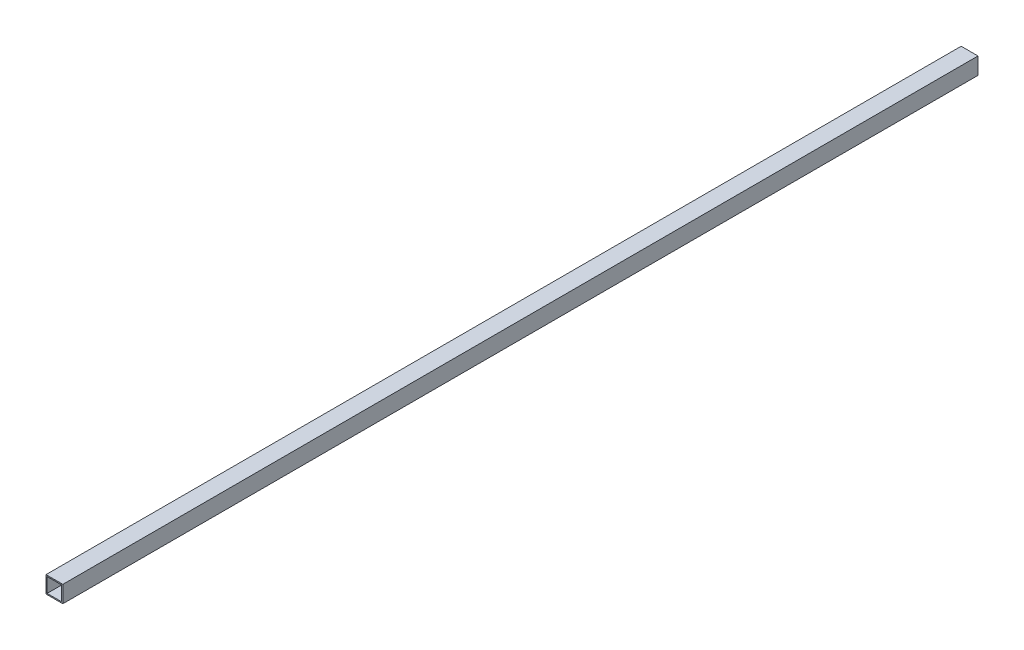
ISO-10303-21;
HEADER;
FILE_DESCRIPTION(('STEP AP214'),'2;1');
FILE_NAME('part.step','',(''),(''),'','','');
FILE_SCHEMA(('AUTOMOTIVE_DESIGN { 1 0 10303 214 1 1 1 1 }'));
ENDSEC;
DATA;
#1=APPLICATION_CONTEXT('core data for automotive mechanical design processes');
#2=APPLICATION_PROTOCOL_DEFINITION('international standard','automotive_design',2000,#1);
#3=PRODUCT_CONTEXT('',#1,'mechanical');
#4=PRODUCT('Part','Part','',(#3));
#5=PRODUCT_RELATED_PRODUCT_CATEGORY('part','',(#4));
#6=PRODUCT_DEFINITION_FORMATION('','',#4);
#7=PRODUCT_DEFINITION_CONTEXT('part definition',#1,'design');
#8=PRODUCT_DEFINITION('design','',#6,#7);
#9=PRODUCT_DEFINITION_SHAPE('','',#8);
#10=(LENGTH_UNIT() NAMED_UNIT(*) SI_UNIT(.MILLI.,.METRE.));
#11=(NAMED_UNIT(*) PLANE_ANGLE_UNIT() SI_UNIT($,.RADIAN.));
#12=(NAMED_UNIT(*) SI_UNIT($,.STERADIAN.) SOLID_ANGLE_UNIT());
#13=UNCERTAINTY_MEASURE_WITH_UNIT(LENGTH_MEASURE(1.E-05),#10,'distance_accuracy_value','');
#14=(GEOMETRIC_REPRESENTATION_CONTEXT(3) GLOBAL_UNCERTAINTY_ASSIGNED_CONTEXT((#13)) GLOBAL_UNIT_ASSIGNED_CONTEXT((#10,
#11,#12)) REPRESENTATION_CONTEXT('',''));
#15=CARTESIAN_POINT('',(0.,0.,0.));
#16=DIRECTION('',(0.,0.,1.));
#17=DIRECTION('',(1.,0.,0.));
#18=AXIS2_PLACEMENT_3D('',#15,#16,#17);
#19=CARTESIAN_POINT('',(0.,0.,815.));
#20=DIRECTION('',(0.,0.,1.));
#21=DIRECTION('',(1.,0.,0.));
#22=AXIS2_PLACEMENT_3D('',#19,#20,#21);
#23=PLANE('',#22);
#24=DIRECTION('',(0.,-1.,0.));
#25=VECTOR('',#24,1.);
#26=CARTESIAN_POINT('',(0.,0.,815.));
#27=LINE('',#26,#25);
#28=CARTESIAN_POINT('',(0.,0.,815.));
#29=VERTEX_POINT('',#28);
#30=CARTESIAN_POINT('',(0.,-15.,815.));
#31=VERTEX_POINT('',#30);
#32=EDGE_CURVE('E166',#29,#31,#27,.T.);
#33=ORIENTED_EDGE('',*,*,#32,.T.);
#34=DIRECTION('',(1.,0.,0.));
#35=VECTOR('',#34,1.);
#36=CARTESIAN_POINT('',(0.,-15.,815.));
#37=LINE('',#36,#35);
#38=CARTESIAN_POINT('',(15.,-15.,815.));
#39=VERTEX_POINT('',#38);
#40=EDGE_CURVE('E169',#31,#39,#37,.T.);
#41=ORIENTED_EDGE('',*,*,#40,.T.);
#42=DIRECTION('',(0.,1.,0.));
#43=VECTOR('',#42,1.);
#44=CARTESIAN_POINT('',(15.,0.,815.));
#45=LINE('',#44,#43);
#46=CARTESIAN_POINT('',(15.,0.,815.));
#47=VERTEX_POINT('',#46);
#48=EDGE_CURVE('E172',#39,#47,#45,.T.);
#49=ORIENTED_EDGE('',*,*,#48,.T.);
#50=DIRECTION('',(-1.,0.,0.));
#51=VECTOR('',#50,1.);
#52=CARTESIAN_POINT('',(0.,0.,815.));
#53=LINE('',#52,#51);
#54=EDGE_CURVE('E174',#47,#29,#53,.T.);
#55=ORIENTED_EDGE('',*,*,#54,.T.);
#56=EDGE_LOOP('',(#33,#41,#49,#55));
#57=FACE_BOUND('',#56,.T.);
#58=DIRECTION('',(1.,0.,0.));
#59=VECTOR('',#58,1.);
#60=CARTESIAN_POINT('',(0.,-14.,815.));
#61=LINE('',#60,#59);
#62=CARTESIAN_POINT('',(1.,-14.,815.));
#63=VERTEX_POINT('',#62);
#64=CARTESIAN_POINT('',(14.,-14.,815.));
#65=VERTEX_POINT('',#64);
#66=EDGE_CURVE('E138',#63,#65,#61,.T.);
#67=ORIENTED_EDGE('',*,*,#66,.F.);
#68=DIRECTION('',(0.,-1.,0.));
#69=VECTOR('',#68,1.);
#70=CARTESIAN_POINT('',(1.,0.,815.));
#71=LINE('',#70,#69);
#72=CARTESIAN_POINT('',(1.,-1.,815.));
#73=VERTEX_POINT('',#72);
#74=EDGE_CURVE('E130',#73,#63,#71,.T.);
#75=ORIENTED_EDGE('',*,*,#74,.F.);
#76=DIRECTION('',(-1.,0.,0.));
#77=VECTOR('',#76,1.);
#78=CARTESIAN_POINT('',(0.,-1.,815.));
#79=LINE('',#78,#77);
#80=CARTESIAN_POINT('',(14.,-1.,815.));
#81=VERTEX_POINT('',#80);
#82=EDGE_CURVE('E152',#81,#73,#79,.T.);
#83=ORIENTED_EDGE('',*,*,#82,.F.);
#84=DIRECTION('',(0.,1.,0.));
#85=VECTOR('',#84,1.);
#86=CARTESIAN_POINT('',(14.,0.,815.));
#87=LINE('',#86,#85);
#88=EDGE_CURVE('E150',#65,#81,#87,.T.);
#89=ORIENTED_EDGE('',*,*,#88,.F.);
#90=EDGE_LOOP('',(#67,#75,#83,#89));
#91=FACE_BOUND('',#90,.T.);
#92=ADVANCED_FACE('F65',(#57,#91),#23,.T.);
#93=CARTESIAN_POINT('',(0.,0.,0.));
#94=DIRECTION('',(0.,0.,1.));
#95=DIRECTION('',(1.,0.,0.));
#96=AXIS2_PLACEMENT_3D('',#93,#94,#95);
#97=PLANE('',#96);
#98=DIRECTION('',(0.,-1.,0.));
#99=VECTOR('',#98,1.);
#100=CARTESIAN_POINT('',(0.,0.,0.));
#101=LINE('',#100,#99);
#102=CARTESIAN_POINT('',(0.,0.,0.));
#103=VERTEX_POINT('',#102);
#104=CARTESIAN_POINT('',(0.,-15.,0.));
#105=VERTEX_POINT('',#104);
#106=EDGE_CURVE('E146',#103,#105,#101,.T.);
#107=ORIENTED_EDGE('',*,*,#106,.F.);
#108=DIRECTION('',(-1.,0.,0.));
#109=VECTOR('',#108,1.);
#110=CARTESIAN_POINT('',(0.,0.,0.));
#111=LINE('',#110,#109);
#112=CARTESIAN_POINT('',(15.,0.,0.));
#113=VERTEX_POINT('',#112);
#114=EDGE_CURVE('E170',#113,#103,#111,.T.);
#115=ORIENTED_EDGE('',*,*,#114,.F.);
#116=DIRECTION('',(0.,1.,0.));
#117=VECTOR('',#116,1.);
#118=CARTESIAN_POINT('',(15.,0.,0.));
#119=LINE('',#118,#117);
#120=CARTESIAN_POINT('',(15.,-15.,0.));
#121=VERTEX_POINT('',#120);
#122=EDGE_CURVE('E181',#121,#113,#119,.T.);
#123=ORIENTED_EDGE('',*,*,#122,.F.);
#124=DIRECTION('',(1.,0.,0.));
#125=VECTOR('',#124,1.);
#126=CARTESIAN_POINT('',(0.,-15.,0.));
#127=LINE('',#126,#125);
#128=EDGE_CURVE('E179',#105,#121,#127,.T.);
#129=ORIENTED_EDGE('',*,*,#128,.F.);
#130=EDGE_LOOP('',(#107,#115,#123,#129));
#131=FACE_BOUND('',#130,.T.);
#132=DIRECTION('',(0.,-1.,0.));
#133=VECTOR('',#132,1.);
#134=CARTESIAN_POINT('',(1.,0.,0.));
#135=LINE('',#134,#133);
#136=CARTESIAN_POINT('',(1.,-1.,0.));
#137=VERTEX_POINT('',#136);
#138=CARTESIAN_POINT('',(1.,-14.,0.));
#139=VERTEX_POINT('',#138);
#140=EDGE_CURVE('E88',#137,#139,#135,.T.);
#141=ORIENTED_EDGE('',*,*,#140,.T.);
#142=DIRECTION('',(1.,0.,0.));
#143=VECTOR('',#142,1.);
#144=CARTESIAN_POINT('',(0.,-14.,0.));
#145=LINE('',#144,#143);
#146=CARTESIAN_POINT('',(14.,-14.,0.));
#147=VERTEX_POINT('',#146);
#148=EDGE_CURVE('E145',#139,#147,#145,.T.);
#149=ORIENTED_EDGE('',*,*,#148,.T.);
#150=DIRECTION('',(0.,1.,0.));
#151=VECTOR('',#150,1.);
#152=CARTESIAN_POINT('',(14.,0.,0.));
#153=LINE('',#152,#151);
#154=CARTESIAN_POINT('',(14.,-1.,0.));
#155=VERTEX_POINT('',#154);
#156=EDGE_CURVE('E158',#147,#155,#153,.T.);
#157=ORIENTED_EDGE('',*,*,#156,.T.);
#158=DIRECTION('',(-1.,0.,0.));
#159=VECTOR('',#158,1.);
#160=CARTESIAN_POINT('',(0.,-1.,0.));
#161=LINE('',#160,#159);
#162=EDGE_CURVE('E139',#155,#137,#161,.T.);
#163=ORIENTED_EDGE('',*,*,#162,.T.);
#164=EDGE_LOOP('',(#141,#149,#157,#163));
#165=FACE_BOUND('',#164,.T.);
#166=ADVANCED_FACE('F199',(#131,#165),#97,.F.);
#167=CARTESIAN_POINT('',(0.,0.,815.));
#168=DIRECTION('',(1.,0.,0.));
#169=DIRECTION('',(0.,0.,-1.));
#170=AXIS2_PLACEMENT_3D('',#167,#168,#169);
#171=PLANE('',#170);
#172=ORIENTED_EDGE('',*,*,#106,.T.);
#173=DIRECTION('',(0.,0.,-1.));
#174=VECTOR('',#173,1.);
#175=CARTESIAN_POINT('',(0.,-15.,815.));
#176=LINE('',#175,#174);
#177=EDGE_CURVE('E12',#31,#105,#176,.T.);
#178=ORIENTED_EDGE('',*,*,#177,.F.);
#179=ORIENTED_EDGE('',*,*,#32,.F.);
#180=DIRECTION('',(0.,0.,-1.));
#181=VECTOR('',#180,1.);
#182=CARTESIAN_POINT('',(0.,0.,815.));
#183=LINE('',#182,#181);
#184=EDGE_CURVE('E176',#29,#103,#183,.T.);
#185=ORIENTED_EDGE('',*,*,#184,.T.);
#186=EDGE_LOOP('',(#172,#178,#179,#185));
#187=FACE_BOUND('',#186,.T.);
#188=ADVANCED_FACE('F67',(#187),#171,.F.);
#189=CARTESIAN_POINT('',(0.,-15.,815.));
#190=DIRECTION('',(0.,1.,0.));
#191=DIRECTION('',(0.,0.,1.));
#192=AXIS2_PLACEMENT_3D('',#189,#190,#191);
#193=PLANE('',#192);
#194=ORIENTED_EDGE('',*,*,#128,.T.);
#195=DIRECTION('',(0.,0.,-1.));
#196=VECTOR('',#195,1.);
#197=CARTESIAN_POINT('',(15.,-15.,815.));
#198=LINE('',#197,#196);
#199=EDGE_CURVE('E73',#39,#121,#198,.T.);
#200=ORIENTED_EDGE('',*,*,#199,.F.);
#201=ORIENTED_EDGE('',*,*,#40,.F.);
#202=ORIENTED_EDGE('',*,*,#177,.T.);
#203=EDGE_LOOP('',(#194,#200,#201,#202));
#204=FACE_BOUND('',#203,.T.);
#205=ADVANCED_FACE('F209',(#204),#193,.F.);
#206=CARTESIAN_POINT('',(15.,0.,815.));
#207=DIRECTION('',(-1.,0.,0.));
#208=DIRECTION('',(0.,-1.,0.));
#209=AXIS2_PLACEMENT_3D('',#206,#207,#208);
#210=PLANE('',#209);
#211=ORIENTED_EDGE('',*,*,#122,.T.);
#212=DIRECTION('',(0.,0.,-1.));
#213=VECTOR('',#212,1.);
#214=CARTESIAN_POINT('',(15.,0.,815.));
#215=LINE('',#214,#213);
#216=EDGE_CURVE('E186',#47,#113,#215,.T.);
#217=ORIENTED_EDGE('',*,*,#216,.F.);
#218=ORIENTED_EDGE('',*,*,#48,.F.);
#219=ORIENTED_EDGE('',*,*,#199,.T.);
#220=EDGE_LOOP('',(#211,#217,#218,#219));
#221=FACE_BOUND('',#220,.T.);
#222=ADVANCED_FACE('F193',(#221),#210,.F.);
#223=CARTESIAN_POINT('',(0.,0.,815.));
#224=DIRECTION('',(0.,-1.,0.));
#225=DIRECTION('',(0.,0.,-1.));
#226=AXIS2_PLACEMENT_3D('',#223,#224,#225);
#227=PLANE('',#226);
#228=ORIENTED_EDGE('',*,*,#114,.T.);
#229=ORIENTED_EDGE('',*,*,#184,.F.);
#230=ORIENTED_EDGE('',*,*,#54,.F.);
#231=ORIENTED_EDGE('',*,*,#216,.T.);
#232=EDGE_LOOP('',(#228,#229,#230,#231));
#233=FACE_BOUND('',#232,.T.);
#234=ADVANCED_FACE('F203',(#233),#227,.F.);
#235=CARTESIAN_POINT('',(1.,0.,815.));
#236=DIRECTION('',(1.,0.,0.));
#237=DIRECTION('',(0.,0.,-1.));
#238=AXIS2_PLACEMENT_3D('',#235,#236,#237);
#239=PLANE('',#238);
#240=ORIENTED_EDGE('',*,*,#140,.F.);
#241=DIRECTION('',(0.,0.,-1.));
#242=VECTOR('',#241,1.);
#243=CARTESIAN_POINT('',(1.,-1.,815.));
#244=LINE('',#243,#242);
#245=EDGE_CURVE('E134',#73,#137,#244,.T.);
#246=ORIENTED_EDGE('',*,*,#245,.F.);
#247=ORIENTED_EDGE('',*,*,#74,.T.);
#248=DIRECTION('',(0.,0.,-1.));
#249=VECTOR('',#248,1.);
#250=CARTESIAN_POINT('',(1.,-14.,815.));
#251=LINE('',#250,#249);
#252=EDGE_CURVE('E133',#63,#139,#251,.T.);
#253=ORIENTED_EDGE('',*,*,#252,.T.);
#254=EDGE_LOOP('',(#240,#246,#247,#253));
#255=FACE_BOUND('',#254,.T.);
#256=ADVANCED_FACE('F132',(#255),#239,.T.);
#257=CARTESIAN_POINT('',(0.,-14.,815.));
#258=DIRECTION('',(0.,1.,0.));
#259=DIRECTION('',(0.,0.,1.));
#260=AXIS2_PLACEMENT_3D('',#257,#258,#259);
#261=PLANE('',#260);
#262=ORIENTED_EDGE('',*,*,#148,.F.);
#263=ORIENTED_EDGE('',*,*,#252,.F.);
#264=ORIENTED_EDGE('',*,*,#66,.T.);
#265=DIRECTION('',(0.,0.,-1.));
#266=VECTOR('',#265,1.);
#267=CARTESIAN_POINT('',(14.,-14.,815.));
#268=LINE('',#267,#266);
#269=EDGE_CURVE('E147',#65,#147,#268,.T.);
#270=ORIENTED_EDGE('',*,*,#269,.T.);
#271=EDGE_LOOP('',(#262,#263,#264,#270));
#272=FACE_BOUND('',#271,.T.);
#273=ADVANCED_FACE('F142',(#272),#261,.T.);
#274=CARTESIAN_POINT('',(14.,0.,815.));
#275=DIRECTION('',(-1.,0.,0.));
#276=DIRECTION('',(0.,-1.,0.));
#277=AXIS2_PLACEMENT_3D('',#274,#275,#276);
#278=PLANE('',#277);
#279=ORIENTED_EDGE('',*,*,#156,.F.);
#280=ORIENTED_EDGE('',*,*,#269,.F.);
#281=ORIENTED_EDGE('',*,*,#88,.T.);
#282=DIRECTION('',(0.,0.,-1.));
#283=VECTOR('',#282,1.);
#284=CARTESIAN_POINT('',(14.,-1.,815.));
#285=LINE('',#284,#283);
#286=EDGE_CURVE('E80',#81,#155,#285,.T.);
#287=ORIENTED_EDGE('',*,*,#286,.T.);
#288=EDGE_LOOP('',(#279,#280,#281,#287));
#289=FACE_BOUND('',#288,.T.);
#290=ADVANCED_FACE('F232',(#289),#278,.T.);
#291=CARTESIAN_POINT('',(0.,-1.,815.));
#292=DIRECTION('',(0.,-1.,0.));
#293=DIRECTION('',(0.,0.,-1.));
#294=AXIS2_PLACEMENT_3D('',#291,#292,#293);
#295=PLANE('',#294);
#296=ORIENTED_EDGE('',*,*,#162,.F.);
#297=ORIENTED_EDGE('',*,*,#286,.F.);
#298=ORIENTED_EDGE('',*,*,#82,.T.);
#299=ORIENTED_EDGE('',*,*,#245,.T.);
#300=EDGE_LOOP('',(#296,#297,#298,#299));
#301=FACE_BOUND('',#300,.T.);
#302=ADVANCED_FACE('F236',(#301),#295,.T.);
#303=CLOSED_SHELL('',(#92,#166,#188,#205,#222,#234,#256,#273,#290,#302));
#304=MANIFOLD_SOLID_BREP('B2',#303);
#305=ADVANCED_BREP_SHAPE_REPRESENTATION('',(#18,#304),#14);
#306=SHAPE_DEFINITION_REPRESENTATION(#9,#305);
ENDSEC;
END-ISO-10303-21;
